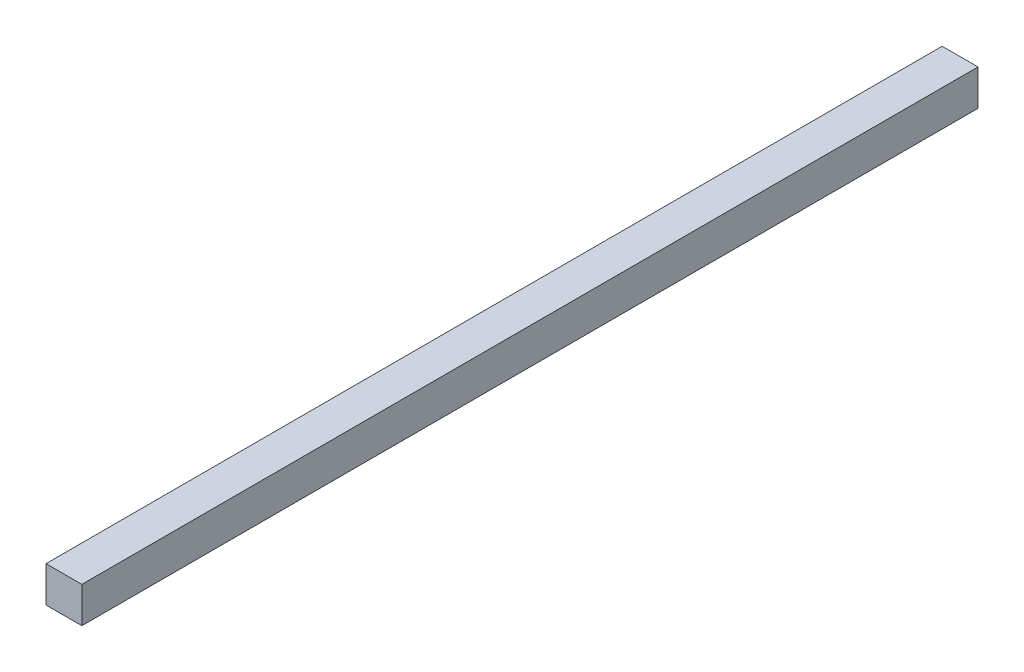
ISO-10303-21;
HEADER;
FILE_DESCRIPTION(('STEP AP214'),'2;1');
FILE_NAME('part.step','',(''),(''),'','','');
FILE_SCHEMA(('AUTOMOTIVE_DESIGN { 1 0 10303 214 1 1 1 1 }'));
ENDSEC;
DATA;
#1=APPLICATION_CONTEXT('core data for automotive mechanical design processes');
#2=APPLICATION_PROTOCOL_DEFINITION('international standard','automotive_design',2000,#1);
#3=PRODUCT_CONTEXT('',#1,'mechanical');
#4=PRODUCT('Part','Part','',(#3));
#5=PRODUCT_RELATED_PRODUCT_CATEGORY('part','',(#4));
#6=PRODUCT_DEFINITION_FORMATION('','',#4);
#7=PRODUCT_DEFINITION_CONTEXT('part definition',#1,'design');
#8=PRODUCT_DEFINITION('design','',#6,#7);
#9=PRODUCT_DEFINITION_SHAPE('','',#8);
#10=(LENGTH_UNIT() NAMED_UNIT(*) SI_UNIT(.MILLI.,.METRE.));
#11=(NAMED_UNIT(*) PLANE_ANGLE_UNIT() SI_UNIT($,.RADIAN.));
#12=(NAMED_UNIT(*) SI_UNIT($,.STERADIAN.) SOLID_ANGLE_UNIT());
#13=UNCERTAINTY_MEASURE_WITH_UNIT(LENGTH_MEASURE(1.E-05),#10,'distance_accuracy_value','');
#14=(GEOMETRIC_REPRESENTATION_CONTEXT(3) GLOBAL_UNCERTAINTY_ASSIGNED_CONTEXT((#13)) GLOBAL_UNIT_ASSIGNED_CONTEXT((#10,
#11,#12)) REPRESENTATION_CONTEXT('',''));
#15=CARTESIAN_POINT('',(0.,0.,0.));
#16=DIRECTION('',(0.,0.,1.));
#17=DIRECTION('',(1.,0.,0.));
#18=AXIS2_PLACEMENT_3D('',#15,#16,#17);
#19=CARTESIAN_POINT('',(-1.6,1.6,80.));
#20=DIRECTION('',(1.,0.,0.));
#21=DIRECTION('',(0.,1.,0.));
#22=AXIS2_PLACEMENT_3D('',#19,#20,#21);
#23=PLANE('',#22);
#24=DIRECTION('',(0.,-1.,0.));
#25=VECTOR('',#24,1.);
#26=CARTESIAN_POINT('',(-1.6,1.6,0.));
#27=LINE('',#26,#25);
#28=CARTESIAN_POINT('',(-1.6,1.6,0.));
#29=VERTEX_POINT('',#28);
#30=CARTESIAN_POINT('',(-1.6,-1.6,0.));
#31=VERTEX_POINT('',#30);
#32=EDGE_CURVE('E96',#29,#31,#27,.T.);
#33=ORIENTED_EDGE('',*,*,#32,.T.);
#34=DIRECTION('',(0.,0.,-1.));
#35=VECTOR('',#34,1.);
#36=CARTESIAN_POINT('',(-1.6,-1.6,80.));
#37=LINE('',#36,#35);
#38=CARTESIAN_POINT('',(-1.6,-1.6,80.));
#39=VERTEX_POINT('',#38);
#40=EDGE_CURVE('E11',#39,#31,#37,.T.);
#41=ORIENTED_EDGE('',*,*,#40,.F.);
#42=DIRECTION('',(0.,-1.,0.));
#43=VECTOR('',#42,1.);
#44=CARTESIAN_POINT('',(-1.6,1.6,80.));
#45=LINE('',#44,#43);
#46=CARTESIAN_POINT('',(-1.6,1.6,80.));
#47=VERTEX_POINT('',#46);
#48=EDGE_CURVE('E84',#47,#39,#45,.T.);
#49=ORIENTED_EDGE('',*,*,#48,.F.);
#50=DIRECTION('',(0.,0.,-1.));
#51=VECTOR('',#50,1.);
#52=CARTESIAN_POINT('',(-1.6,1.6,80.));
#53=LINE('',#52,#51);
#54=EDGE_CURVE('E92',#47,#29,#53,.T.);
#55=ORIENTED_EDGE('',*,*,#54,.T.);
#56=EDGE_LOOP('',(#33,#41,#49,#55));
#57=FACE_BOUND('',#56,.T.);
#58=ADVANCED_FACE('F33',(#57),#23,.F.);
#59=CARTESIAN_POINT('',(1.6,-1.6,80.));
#60=DIRECTION('',(0.,1.,0.));
#61=DIRECTION('',(-1.,0.,0.));
#62=AXIS2_PLACEMENT_3D('',#59,#60,#61);
#63=PLANE('',#62);
#64=DIRECTION('',(1.,0.,0.));
#65=VECTOR('',#64,1.);
#66=CARTESIAN_POINT('',(1.6,-1.6,0.));
#67=LINE('',#66,#65);
#68=CARTESIAN_POINT('',(1.6,-1.6,0.));
#69=VERTEX_POINT('',#68);
#70=EDGE_CURVE('E88',#31,#69,#67,.T.);
#71=ORIENTED_EDGE('',*,*,#70,.T.);
#72=DIRECTION('',(0.,0.,-1.));
#73=VECTOR('',#72,1.);
#74=CARTESIAN_POINT('',(1.6,-1.6,80.));
#75=LINE('',#74,#73);
#76=CARTESIAN_POINT('',(1.6,-1.6,80.));
#77=VERTEX_POINT('',#76);
#78=EDGE_CURVE('E41',#77,#69,#75,.T.);
#79=ORIENTED_EDGE('',*,*,#78,.F.);
#80=DIRECTION('',(1.,0.,0.));
#81=VECTOR('',#80,1.);
#82=CARTESIAN_POINT('',(1.6,-1.6,80.));
#83=LINE('',#82,#81);
#84=EDGE_CURVE('E79',#39,#77,#83,.T.);
#85=ORIENTED_EDGE('',*,*,#84,.F.);
#86=ORIENTED_EDGE('',*,*,#40,.T.);
#87=EDGE_LOOP('',(#71,#79,#85,#86));
#88=FACE_BOUND('',#87,.T.);
#89=ADVANCED_FACE('F87',(#88),#63,.F.);
#90=CARTESIAN_POINT('',(1.6,1.6,80.));
#91=DIRECTION('',(-1.,0.,0.));
#92=DIRECTION('',(0.,-1.,0.));
#93=AXIS2_PLACEMENT_3D('',#90,#91,#92);
#94=PLANE('',#93);
#95=DIRECTION('',(0.,1.,0.));
#96=VECTOR('',#95,1.);
#97=CARTESIAN_POINT('',(1.6,1.6,0.));
#98=LINE('',#97,#96);
#99=CARTESIAN_POINT('',(1.6,1.6,0.));
#100=VERTEX_POINT('',#99);
#101=EDGE_CURVE('E66',#69,#100,#98,.T.);
#102=ORIENTED_EDGE('',*,*,#101,.T.);
#103=DIRECTION('',(0.,0.,-1.));
#104=VECTOR('',#103,1.);
#105=CARTESIAN_POINT('',(1.6,1.6,80.));
#106=LINE('',#105,#104);
#107=CARTESIAN_POINT('',(1.6,1.6,80.));
#108=VERTEX_POINT('',#107);
#109=EDGE_CURVE('E89',#108,#100,#106,.T.);
#110=ORIENTED_EDGE('',*,*,#109,.F.);
#111=DIRECTION('',(0.,1.,0.));
#112=VECTOR('',#111,1.);
#113=CARTESIAN_POINT('',(1.6,1.6,80.));
#114=LINE('',#113,#112);
#115=EDGE_CURVE('E82',#77,#108,#114,.T.);
#116=ORIENTED_EDGE('',*,*,#115,.F.);
#117=ORIENTED_EDGE('',*,*,#78,.T.);
#118=EDGE_LOOP('',(#102,#110,#116,#117));
#119=FACE_BOUND('',#118,.T.);
#120=ADVANCED_FACE('F90',(#119),#94,.F.);
#121=CARTESIAN_POINT('',(1.6,1.6,80.));
#122=DIRECTION('',(0.,-1.,0.));
#123=DIRECTION('',(1.,0.,0.));
#124=AXIS2_PLACEMENT_3D('',#121,#122,#123);
#125=PLANE('',#124);
#126=DIRECTION('',(-1.,0.,0.));
#127=VECTOR('',#126,1.);
#128=CARTESIAN_POINT('',(1.6,1.6,0.));
#129=LINE('',#128,#127);
#130=EDGE_CURVE('E72',#100,#29,#129,.T.);
#131=ORIENTED_EDGE('',*,*,#130,.T.);
#132=ORIENTED_EDGE('',*,*,#54,.F.);
#133=DIRECTION('',(-1.,0.,0.));
#134=VECTOR('',#133,1.);
#135=CARTESIAN_POINT('',(1.6,1.6,80.));
#136=LINE('',#135,#134);
#137=EDGE_CURVE('E49',#108,#47,#136,.T.);
#138=ORIENTED_EDGE('',*,*,#137,.F.);
#139=ORIENTED_EDGE('',*,*,#109,.T.);
#140=EDGE_LOOP('',(#131,#132,#138,#139));
#141=FACE_BOUND('',#140,.T.);
#142=ADVANCED_FACE('F103',(#141),#125,.F.);
#143=CARTESIAN_POINT('',(0.,0.,80.));
#144=DIRECTION('',(0.,0.,-1.));
#145=DIRECTION('',(-1.,0.,0.));
#146=AXIS2_PLACEMENT_3D('',#143,#144,#145);
#147=PLANE('',#146);
#148=ORIENTED_EDGE('',*,*,#48,.T.);
#149=ORIENTED_EDGE('',*,*,#84,.T.);
#150=ORIENTED_EDGE('',*,*,#115,.T.);
#151=ORIENTED_EDGE('',*,*,#137,.T.);
#152=EDGE_LOOP('',(#148,#149,#150,#151));
#153=FACE_BOUND('',#152,.T.);
#154=ADVANCED_FACE('F80',(#153),#147,.F.);
#155=CARTESIAN_POINT('',(0.,0.,0.));
#156=DIRECTION('',(0.,0.,-1.));
#157=DIRECTION('',(-1.,0.,0.));
#158=AXIS2_PLACEMENT_3D('',#155,#156,#157);
#159=PLANE('',#158);
#160=ORIENTED_EDGE('',*,*,#32,.F.);
#161=ORIENTED_EDGE('',*,*,#130,.F.);
#162=ORIENTED_EDGE('',*,*,#101,.F.);
#163=ORIENTED_EDGE('',*,*,#70,.F.);
#164=EDGE_LOOP('',(#160,#161,#162,#163));
#165=FACE_BOUND('',#164,.T.);
#166=ADVANCED_FACE('F106',(#165),#159,.T.);
#167=CLOSED_SHELL('',(#58,#89,#120,#142,#154,#166));
#168=MANIFOLD_SOLID_BREP('B2',#167);
#169=ADVANCED_BREP_SHAPE_REPRESENTATION('',(#18,#168),#14);
#170=SHAPE_DEFINITION_REPRESENTATION(#9,#169);
ENDSEC;
END-ISO-10303-21;
